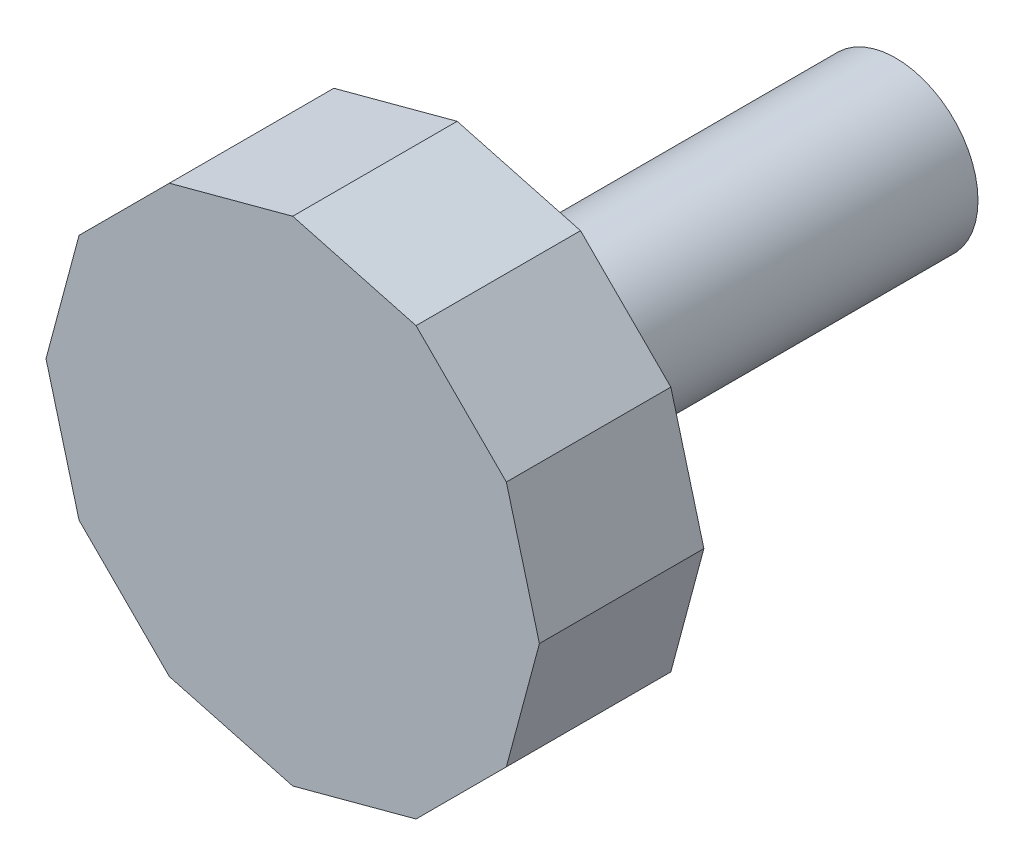
ISO-10303-21;
HEADER;
FILE_DESCRIPTION(('STEP AP214'),'2;1');
FILE_NAME('part.step','',(''),(''),'','','');
FILE_SCHEMA(('AUTOMOTIVE_DESIGN { 1 0 10303 214 1 1 1 1 }'));
ENDSEC;
DATA;
#1=APPLICATION_CONTEXT('core data for automotive mechanical design processes');
#2=APPLICATION_PROTOCOL_DEFINITION('international standard','automotive_design',2000,#1);
#3=PRODUCT_CONTEXT('',#1,'mechanical');
#4=PRODUCT('Part','Part','',(#3));
#5=PRODUCT_RELATED_PRODUCT_CATEGORY('part','',(#4));
#6=PRODUCT_DEFINITION_FORMATION('','',#4);
#7=PRODUCT_DEFINITION_CONTEXT('part definition',#1,'design');
#8=PRODUCT_DEFINITION('design','',#6,#7);
#9=PRODUCT_DEFINITION_SHAPE('','',#8);
#10=(LENGTH_UNIT() NAMED_UNIT(*) SI_UNIT(.MILLI.,.METRE.));
#11=(NAMED_UNIT(*) PLANE_ANGLE_UNIT() SI_UNIT($,.RADIAN.));
#12=(NAMED_UNIT(*) SI_UNIT($,.STERADIAN.) SOLID_ANGLE_UNIT());
#13=UNCERTAINTY_MEASURE_WITH_UNIT(LENGTH_MEASURE(1.E-05),#10,'distance_accuracy_value','');
#14=(GEOMETRIC_REPRESENTATION_CONTEXT(3) GLOBAL_UNCERTAINTY_ASSIGNED_CONTEXT((#13)) GLOBAL_UNIT_ASSIGNED_CONTEXT((#10,
#11,#12)) REPRESENTATION_CONTEXT('',''));
#15=CARTESIAN_POINT('',(0.,0.,0.));
#16=DIRECTION('',(0.,0.,1.));
#17=DIRECTION('',(1.,0.,0.));
#18=AXIS2_PLACEMENT_3D('',#15,#16,#17);
#19=CARTESIAN_POINT('',(0.,0.,8.));
#20=DIRECTION('',(0.,0.,-1.));
#21=DIRECTION('',(-1.,0.,0.));
#22=AXIS2_PLACEMENT_3D('',#19,#20,#21);
#23=CYLINDRICAL_SURFACE('',#22,1.5);
#24=CARTESIAN_POINT('',(0.,0.,8.));
#25=DIRECTION('',(0.,0.,1.));
#26=DIRECTION('',(1.,0.,0.));
#27=AXIS2_PLACEMENT_3D('',#24,#25,#26);
#28=CIRCLE('',#27,1.5);
#29=CARTESIAN_POINT('',(1.5,0.,8.));
#30=VERTEX_POINT('',#29);
#31=EDGE_CURVE('E11',#30,#30,#28,.T.);
#32=ORIENTED_EDGE('',*,*,#31,.F.);
#33=EDGE_LOOP('',(#32));
#34=FACE_BOUND('',#33,.T.);
#35=CARTESIAN_POINT('',(0.,0.,0.));
#36=DIRECTION('',(0.,0.,1.));
#37=DIRECTION('',(1.,0.,0.));
#38=AXIS2_PLACEMENT_3D('',#35,#36,#37);
#39=CIRCLE('',#38,1.5);
#40=CARTESIAN_POINT('',(1.5,0.,0.));
#41=VERTEX_POINT('',#40);
#42=EDGE_CURVE('E44',#41,#41,#39,.T.);
#43=ORIENTED_EDGE('',*,*,#42,.T.);
#44=EDGE_LOOP('',(#43));
#45=FACE_BOUND('',#44,.T.);
#46=ADVANCED_FACE('F41',(#34,#45),#23,.T.);
#47=CARTESIAN_POINT('',(0.,0.,0.));
#48=DIRECTION('',(0.,0.,1.));
#49=DIRECTION('',(1.,0.,0.));
#50=AXIS2_PLACEMENT_3D('',#47,#48,#49);
#51=PLANE('',#50);
#52=ORIENTED_EDGE('',*,*,#42,.F.);
#53=EDGE_LOOP('',(#52));
#54=FACE_BOUND('',#53,.T.);
#55=ADVANCED_FACE('F215',(#54),#51,.F.);
#56=CARTESIAN_POINT('',(3.89711431702997,-2.25,11.));
#57=DIRECTION('',(-0.965925826289068,0.258819045102521,0.));
#58=DIRECTION('',(-0.258819045102521,-0.965925826289068,0.));
#59=AXIS2_PLACEMENT_3D('',#56,#57,#58);
#60=PLANE('',#59);
#61=DIRECTION('',(0.258819045102521,0.965925826289068,0.));
#62=VECTOR('',#61,1.);
#63=CARTESIAN_POINT('',(3.89711431702997,-2.25,8.));
#64=LINE('',#63,#62);
#65=CARTESIAN_POINT('',(3.89711431702997,-2.25,8.));
#66=VERTEX_POINT('',#65);
#67=CARTESIAN_POINT('',(4.5,0.,8.));
#68=VERTEX_POINT('',#67);
#69=EDGE_CURVE('E162',#66,#68,#64,.T.);
#70=ORIENTED_EDGE('',*,*,#69,.T.);
#71=DIRECTION('',(0.,0.,-1.));
#72=VECTOR('',#71,1.);
#73=CARTESIAN_POINT('',(4.5,0.,11.));
#74=LINE('',#73,#72);
#75=CARTESIAN_POINT('',(4.5,0.,11.));
#76=VERTEX_POINT('',#75);
#77=EDGE_CURVE('E209',#76,#68,#74,.T.);
#78=ORIENTED_EDGE('',*,*,#77,.F.);
#79=DIRECTION('',(0.258819045102521,0.965925826289068,0.));
#80=VECTOR('',#79,1.);
#81=CARTESIAN_POINT('',(3.89711431702997,-2.25,11.));
#82=LINE('',#81,#80);
#83=CARTESIAN_POINT('',(3.89711431702997,-2.25,11.));
#84=VERTEX_POINT('',#83);
#85=EDGE_CURVE('E184',#84,#76,#82,.T.);
#86=ORIENTED_EDGE('',*,*,#85,.F.);
#87=DIRECTION('',(0.,0.,-1.));
#88=VECTOR('',#87,1.);
#89=CARTESIAN_POINT('',(3.89711431702997,-2.25,11.));
#90=LINE('',#89,#88);
#91=EDGE_CURVE('E158',#84,#66,#90,.T.);
#92=ORIENTED_EDGE('',*,*,#91,.T.);
#93=EDGE_LOOP('',(#70,#78,#86,#92));
#94=FACE_BOUND('',#93,.T.);
#95=ADVANCED_FACE('F217',(#94),#60,.F.);
#96=CARTESIAN_POINT('',(4.5,0.,11.));
#97=DIRECTION('',(-0.965925826289068,-0.258819045102521,0.));
#98=DIRECTION('',(0.258819045102521,-0.965925826289068,0.));
#99=AXIS2_PLACEMENT_3D('',#96,#97,#98);
#100=PLANE('',#99);
#101=DIRECTION('',(-0.258819045102521,0.965925826289068,0.));
#102=VECTOR('',#101,1.);
#103=CARTESIAN_POINT('',(4.5,0.,8.));
#104=LINE('',#103,#102);
#105=CARTESIAN_POINT('',(3.89711431702997,2.25,8.));
#106=VERTEX_POINT('',#105);
#107=EDGE_CURVE('E165',#68,#106,#104,.T.);
#108=ORIENTED_EDGE('',*,*,#107,.T.);
#109=DIRECTION('',(0.,0.,-1.));
#110=VECTOR('',#109,1.);
#111=CARTESIAN_POINT('',(3.89711431702997,2.25,11.));
#112=LINE('',#111,#110);
#113=CARTESIAN_POINT('',(3.89711431702997,2.25,11.));
#114=VERTEX_POINT('',#113);
#115=EDGE_CURVE('E206',#114,#106,#112,.T.);
#116=ORIENTED_EDGE('',*,*,#115,.F.);
#117=DIRECTION('',(-0.258819045102521,0.965925826289068,0.));
#118=VECTOR('',#117,1.);
#119=CARTESIAN_POINT('',(4.5,0.,11.));
#120=LINE('',#119,#118);
#121=EDGE_CURVE('E113',#76,#114,#120,.T.);
#122=ORIENTED_EDGE('',*,*,#121,.F.);
#123=ORIENTED_EDGE('',*,*,#77,.T.);
#124=EDGE_LOOP('',(#108,#116,#122,#123));
#125=FACE_BOUND('',#124,.T.);
#126=ADVANCED_FACE('F222',(#125),#100,.F.);
#127=CARTESIAN_POINT('',(3.89711431702997,2.25,11.));
#128=DIRECTION('',(-0.707106781186548,-0.707106781186547,0.));
#129=DIRECTION('',(0.707106781186547,-0.707106781186548,0.));
#130=AXIS2_PLACEMENT_3D('',#127,#128,#129);
#131=PLANE('',#130);
#132=DIRECTION('',(-0.707106781186547,0.707106781186548,0.));
#133=VECTOR('',#132,1.);
#134=CARTESIAN_POINT('',(3.89711431702997,2.25,8.));
#135=LINE('',#134,#133);
#136=CARTESIAN_POINT('',(2.25,3.89711431702997,8.));
#137=VERTEX_POINT('',#136);
#138=EDGE_CURVE('E167',#106,#137,#135,.T.);
#139=ORIENTED_EDGE('',*,*,#138,.T.);
#140=DIRECTION('',(0.,0.,-1.));
#141=VECTOR('',#140,1.);
#142=CARTESIAN_POINT('',(2.25,3.89711431702997,11.));
#143=LINE('',#142,#141);
#144=CARTESIAN_POINT('',(2.25,3.89711431702997,11.));
#145=VERTEX_POINT('',#144);
#146=EDGE_CURVE('E203',#145,#137,#143,.T.);
#147=ORIENTED_EDGE('',*,*,#146,.F.);
#148=DIRECTION('',(-0.707106781186547,0.707106781186548,0.));
#149=VECTOR('',#148,1.);
#150=CARTESIAN_POINT('',(3.89711431702997,2.25,11.));
#151=LINE('',#150,#149);
#152=EDGE_CURVE('E401',#114,#145,#151,.T.);
#153=ORIENTED_EDGE('',*,*,#152,.F.);
#154=ORIENTED_EDGE('',*,*,#115,.T.);
#155=EDGE_LOOP('',(#139,#147,#153,#154));
#156=FACE_BOUND('',#155,.T.);
#157=ADVANCED_FACE('F229',(#156),#131,.F.);
#158=CARTESIAN_POINT('',(2.25,3.89711431702997,11.));
#159=DIRECTION('',(-0.258819045102521,-0.965925826289068,0.));
#160=DIRECTION('',(0.965925826289068,-0.258819045102521,0.));
#161=AXIS2_PLACEMENT_3D('',#158,#159,#160);
#162=PLANE('',#161);
#163=DIRECTION('',(-0.965925826289068,0.258819045102521,0.));
#164=VECTOR('',#163,1.);
#165=CARTESIAN_POINT('',(2.25,3.89711431702997,8.));
#166=LINE('',#165,#164);
#167=CARTESIAN_POINT('',(0.,4.5,8.));
#168=VERTEX_POINT('',#167);
#169=EDGE_CURVE('E169',#137,#168,#166,.T.);
#170=ORIENTED_EDGE('',*,*,#169,.T.);
#171=DIRECTION('',(0.,0.,-1.));
#172=VECTOR('',#171,1.);
#173=CARTESIAN_POINT('',(0.,4.5,11.));
#174=LINE('',#173,#172);
#175=CARTESIAN_POINT('',(0.,4.5,11.));
#176=VERTEX_POINT('',#175);
#177=EDGE_CURVE('E200',#176,#168,#174,.T.);
#178=ORIENTED_EDGE('',*,*,#177,.F.);
#179=DIRECTION('',(-0.965925826289068,0.258819045102521,0.));
#180=VECTOR('',#179,1.);
#181=CARTESIAN_POINT('',(2.25,3.89711431702997,11.));
#182=LINE('',#181,#180);
#183=EDGE_CURVE('E405',#145,#176,#182,.T.);
#184=ORIENTED_EDGE('',*,*,#183,.F.);
#185=ORIENTED_EDGE('',*,*,#146,.T.);
#186=EDGE_LOOP('',(#170,#178,#184,#185));
#187=FACE_BOUND('',#186,.T.);
#188=ADVANCED_FACE('F232',(#187),#162,.F.);
#189=CARTESIAN_POINT('',(0.,4.5,11.));
#190=DIRECTION('',(0.258819045102521,-0.965925826289068,0.));
#191=DIRECTION('',(0.965925826289068,0.258819045102521,0.));
#192=AXIS2_PLACEMENT_3D('',#189,#190,#191);
#193=PLANE('',#192);
#194=DIRECTION('',(-0.965925826289068,-0.258819045102521,0.));
#195=VECTOR('',#194,1.);
#196=CARTESIAN_POINT('',(0.,4.5,8.));
#197=LINE('',#196,#195);
#198=CARTESIAN_POINT('',(-2.25,3.89711431702997,8.));
#199=VERTEX_POINT('',#198);
#200=EDGE_CURVE('E171',#168,#199,#197,.T.);
#201=ORIENTED_EDGE('',*,*,#200,.T.);
#202=DIRECTION('',(0.,0.,-1.));
#203=VECTOR('',#202,1.);
#204=CARTESIAN_POINT('',(-2.25,3.89711431702997,11.));
#205=LINE('',#204,#203);
#206=CARTESIAN_POINT('',(-2.25,3.89711431702997,11.));
#207=VERTEX_POINT('',#206);
#208=EDGE_CURVE('E197',#207,#199,#205,.T.);
#209=ORIENTED_EDGE('',*,*,#208,.F.);
#210=DIRECTION('',(-0.965925826289068,-0.258819045102521,0.));
#211=VECTOR('',#210,1.);
#212=CARTESIAN_POINT('',(0.,4.5,11.));
#213=LINE('',#212,#211);
#214=EDGE_CURVE('E407',#176,#207,#213,.T.);
#215=ORIENTED_EDGE('',*,*,#214,.F.);
#216=ORIENTED_EDGE('',*,*,#177,.T.);
#217=EDGE_LOOP('',(#201,#209,#215,#216));
#218=FACE_BOUND('',#217,.T.);
#219=ADVANCED_FACE('F236',(#218),#193,.F.);
#220=CARTESIAN_POINT('',(-2.25,3.89711431702997,11.));
#221=DIRECTION('',(0.707106781186547,-0.707106781186548,0.));
#222=DIRECTION('',(0.707106781186548,0.707106781186547,0.));
#223=AXIS2_PLACEMENT_3D('',#220,#221,#222);
#224=PLANE('',#223);
#225=DIRECTION('',(-0.707106781186548,-0.707106781186547,0.));
#226=VECTOR('',#225,1.);
#227=CARTESIAN_POINT('',(-2.25,3.89711431702997,8.));
#228=LINE('',#227,#226);
#229=CARTESIAN_POINT('',(-3.89711431702997,2.25,8.));
#230=VERTEX_POINT('',#229);
#231=EDGE_CURVE('E173',#199,#230,#228,.T.);
#232=ORIENTED_EDGE('',*,*,#231,.T.);
#233=DIRECTION('',(0.,0.,-1.));
#234=VECTOR('',#233,1.);
#235=CARTESIAN_POINT('',(-3.89711431702997,2.25,11.));
#236=LINE('',#235,#234);
#237=CARTESIAN_POINT('',(-3.89711431702997,2.25,11.));
#238=VERTEX_POINT('',#237);
#239=EDGE_CURVE('E194',#238,#230,#236,.T.);
#240=ORIENTED_EDGE('',*,*,#239,.F.);
#241=DIRECTION('',(-0.707106781186548,-0.707106781186547,0.));
#242=VECTOR('',#241,1.);
#243=CARTESIAN_POINT('',(-2.25,3.89711431702997,11.));
#244=LINE('',#243,#242);
#245=EDGE_CURVE('E409',#207,#238,#244,.T.);
#246=ORIENTED_EDGE('',*,*,#245,.F.);
#247=ORIENTED_EDGE('',*,*,#208,.T.);
#248=EDGE_LOOP('',(#232,#240,#246,#247));
#249=FACE_BOUND('',#248,.T.);
#250=ADVANCED_FACE('F240',(#249),#224,.F.);
#251=CARTESIAN_POINT('',(-3.89711431702997,2.25,11.));
#252=DIRECTION('',(0.965925826289068,-0.258819045102521,0.));
#253=DIRECTION('',(0.258819045102521,0.965925826289068,0.));
#254=AXIS2_PLACEMENT_3D('',#251,#252,#253);
#255=PLANE('',#254);
#256=DIRECTION('',(-0.258819045102521,-0.965925826289069,0.));
#257=VECTOR('',#256,1.);
#258=CARTESIAN_POINT('',(-3.89711431702997,2.25,8.));
#259=LINE('',#258,#257);
#260=CARTESIAN_POINT('',(-4.5,0.,8.));
#261=VERTEX_POINT('',#260);
#262=EDGE_CURVE('E175',#230,#261,#259,.T.);
#263=ORIENTED_EDGE('',*,*,#262,.T.);
#264=DIRECTION('',(0.,0.,-1.));
#265=VECTOR('',#264,1.);
#266=CARTESIAN_POINT('',(-4.5,0.,11.));
#267=LINE('',#266,#265);
#268=CARTESIAN_POINT('',(-4.5,0.,11.));
#269=VERTEX_POINT('',#268);
#270=EDGE_CURVE('E191',#269,#261,#267,.T.);
#271=ORIENTED_EDGE('',*,*,#270,.F.);
#272=DIRECTION('',(-0.258819045102521,-0.965925826289069,0.));
#273=VECTOR('',#272,1.);
#274=CARTESIAN_POINT('',(-3.89711431702997,2.25,11.));
#275=LINE('',#274,#273);
#276=EDGE_CURVE('E411',#238,#269,#275,.T.);
#277=ORIENTED_EDGE('',*,*,#276,.F.);
#278=ORIENTED_EDGE('',*,*,#239,.T.);
#279=EDGE_LOOP('',(#263,#271,#277,#278));
#280=FACE_BOUND('',#279,.T.);
#281=ADVANCED_FACE('F244',(#280),#255,.F.);
#282=CARTESIAN_POINT('',(-4.5,0.,11.));
#283=DIRECTION('',(0.965925826289068,0.25881904510252,0.));
#284=DIRECTION('',(-0.25881904510252,0.965925826289069,0.));
#285=AXIS2_PLACEMENT_3D('',#282,#283,#284);
#286=PLANE('',#285);
#287=DIRECTION('',(0.25881904510252,-0.965925826289069,0.));
#288=VECTOR('',#287,1.);
#289=CARTESIAN_POINT('',(-4.5,0.,8.));
#290=LINE('',#289,#288);
#291=CARTESIAN_POINT('',(-3.89711431702997,-2.25,8.));
#292=VERTEX_POINT('',#291);
#293=EDGE_CURVE('E177',#261,#292,#290,.T.);
#294=ORIENTED_EDGE('',*,*,#293,.T.);
#295=DIRECTION('',(0.,0.,-1.));
#296=VECTOR('',#295,1.);
#297=CARTESIAN_POINT('',(-3.89711431702997,-2.25,11.));
#298=LINE('',#297,#296);
#299=CARTESIAN_POINT('',(-3.89711431702997,-2.25,11.));
#300=VERTEX_POINT('',#299);
#301=EDGE_CURVE('E188',#300,#292,#298,.T.);
#302=ORIENTED_EDGE('',*,*,#301,.F.);
#303=DIRECTION('',(0.25881904510252,-0.965925826289069,0.));
#304=VECTOR('',#303,1.);
#305=CARTESIAN_POINT('',(-4.5,0.,11.));
#306=LINE('',#305,#304);
#307=EDGE_CURVE('E413',#269,#300,#306,.T.);
#308=ORIENTED_EDGE('',*,*,#307,.F.);
#309=ORIENTED_EDGE('',*,*,#270,.T.);
#310=EDGE_LOOP('',(#294,#302,#308,#309));
#311=FACE_BOUND('',#310,.T.);
#312=ADVANCED_FACE('F248',(#311),#286,.F.);
#313=CARTESIAN_POINT('',(-3.89711431702997,-2.25,11.));
#314=DIRECTION('',(0.707106781186548,0.707106781186547,0.));
#315=DIRECTION('',(-0.707106781186547,0.707106781186548,0.));
#316=AXIS2_PLACEMENT_3D('',#313,#314,#315);
#317=PLANE('',#316);
#318=DIRECTION('',(0.707106781186547,-0.707106781186548,0.));
#319=VECTOR('',#318,1.);
#320=CARTESIAN_POINT('',(-3.89711431702997,-2.25,8.));
#321=LINE('',#320,#319);
#322=CARTESIAN_POINT('',(-2.25,-3.89711431702997,8.));
#323=VERTEX_POINT('',#322);
#324=EDGE_CURVE('E179',#292,#323,#321,.T.);
#325=ORIENTED_EDGE('',*,*,#324,.T.);
#326=DIRECTION('',(0.,0.,-1.));
#327=VECTOR('',#326,1.);
#328=CARTESIAN_POINT('',(-2.25,-3.89711431702997,11.));
#329=LINE('',#328,#327);
#330=CARTESIAN_POINT('',(-2.25,-3.89711431702997,11.));
#331=VERTEX_POINT('',#330);
#332=EDGE_CURVE('E153',#331,#323,#329,.T.);
#333=ORIENTED_EDGE('',*,*,#332,.F.);
#334=DIRECTION('',(0.707106781186547,-0.707106781186548,0.));
#335=VECTOR('',#334,1.);
#336=CARTESIAN_POINT('',(-3.89711431702997,-2.25,11.));
#337=LINE('',#336,#335);
#338=EDGE_CURVE('E144',#300,#331,#337,.T.);
#339=ORIENTED_EDGE('',*,*,#338,.F.);
#340=ORIENTED_EDGE('',*,*,#301,.T.);
#341=EDGE_LOOP('',(#325,#333,#339,#340));
#342=FACE_BOUND('',#341,.T.);
#343=ADVANCED_FACE('F252',(#342),#317,.F.);
#344=CARTESIAN_POINT('',(-2.25,-3.89711431702997,11.));
#345=DIRECTION('',(0.258819045102521,0.965925826289068,0.));
#346=DIRECTION('',(-0.965925826289068,0.258819045102521,0.));
#347=AXIS2_PLACEMENT_3D('',#344,#345,#346);
#348=PLANE('',#347);
#349=DIRECTION('',(0.965925826289068,-0.258819045102521,0.));
#350=VECTOR('',#349,1.);
#351=CARTESIAN_POINT('',(-2.25,-3.89711431702997,8.));
#352=LINE('',#351,#350);
#353=CARTESIAN_POINT('',(0.,-4.5,8.));
#354=VERTEX_POINT('',#353);
#355=EDGE_CURVE('E152',#323,#354,#352,.T.);
#356=ORIENTED_EDGE('',*,*,#355,.T.);
#357=DIRECTION('',(0.,0.,-1.));
#358=VECTOR('',#357,1.);
#359=CARTESIAN_POINT('',(0.,-4.5,11.));
#360=LINE('',#359,#358);
#361=CARTESIAN_POINT('',(0.,-4.5,11.));
#362=VERTEX_POINT('',#361);
#363=EDGE_CURVE('E149',#362,#354,#360,.T.);
#364=ORIENTED_EDGE('',*,*,#363,.F.);
#365=DIRECTION('',(0.965925826289068,-0.258819045102521,0.));
#366=VECTOR('',#365,1.);
#367=CARTESIAN_POINT('',(-2.25,-3.89711431702997,11.));
#368=LINE('',#367,#366);
#369=EDGE_CURVE('E138',#331,#362,#368,.T.);
#370=ORIENTED_EDGE('',*,*,#369,.F.);
#371=ORIENTED_EDGE('',*,*,#332,.T.);
#372=EDGE_LOOP('',(#356,#364,#370,#371));
#373=FACE_BOUND('',#372,.T.);
#374=ADVANCED_FACE('F150',(#373),#348,.F.);
#375=CARTESIAN_POINT('',(0.,-4.5,11.));
#376=DIRECTION('',(-0.258819045102521,0.965925826289068,0.));
#377=DIRECTION('',(-0.965925826289068,-0.258819045102521,0.));
#378=AXIS2_PLACEMENT_3D('',#375,#376,#377);
#379=PLANE('',#378);
#380=DIRECTION('',(0.965925826289068,0.258819045102521,0.));
#381=VECTOR('',#380,1.);
#382=CARTESIAN_POINT('',(0.,-4.5,8.));
#383=LINE('',#382,#381);
#384=CARTESIAN_POINT('',(2.25,-3.89711431702997,8.));
#385=VERTEX_POINT('',#384);
#386=EDGE_CURVE('E98',#354,#385,#383,.T.);
#387=ORIENTED_EDGE('',*,*,#386,.T.);
#388=DIRECTION('',(0.,0.,-1.));
#389=VECTOR('',#388,1.);
#390=CARTESIAN_POINT('',(2.25,-3.89711431702997,11.));
#391=LINE('',#390,#389);
#392=CARTESIAN_POINT('',(2.25,-3.89711431702997,11.));
#393=VERTEX_POINT('',#392);
#394=EDGE_CURVE('E154',#393,#385,#391,.T.);
#395=ORIENTED_EDGE('',*,*,#394,.F.);
#396=DIRECTION('',(0.965925826289068,0.258819045102521,0.));
#397=VECTOR('',#396,1.);
#398=CARTESIAN_POINT('',(0.,-4.5,11.));
#399=LINE('',#398,#397);
#400=EDGE_CURVE('E142',#362,#393,#399,.T.);
#401=ORIENTED_EDGE('',*,*,#400,.F.);
#402=ORIENTED_EDGE('',*,*,#363,.T.);
#403=EDGE_LOOP('',(#387,#395,#401,#402));
#404=FACE_BOUND('',#403,.T.);
#405=ADVANCED_FACE('F156',(#404),#379,.F.);
#406=CARTESIAN_POINT('',(2.25,-3.89711431702997,11.));
#407=DIRECTION('',(-0.707106781186547,0.707106781186548,0.));
#408=DIRECTION('',(-0.707106781186548,-0.707106781186547,0.));
#409=AXIS2_PLACEMENT_3D('',#406,#407,#408);
#410=PLANE('',#409);
#411=DIRECTION('',(0.707106781186548,0.707106781186547,0.));
#412=VECTOR('',#411,1.);
#413=CARTESIAN_POINT('',(2.25,-3.89711431702997,8.));
#414=LINE('',#413,#412);
#415=EDGE_CURVE('E104',#385,#66,#414,.T.);
#416=ORIENTED_EDGE('',*,*,#415,.T.);
#417=ORIENTED_EDGE('',*,*,#91,.F.);
#418=DIRECTION('',(0.707106781186548,0.707106781186547,0.));
#419=VECTOR('',#418,1.);
#420=CARTESIAN_POINT('',(2.25,-3.89711431702997,11.));
#421=LINE('',#420,#419);
#422=EDGE_CURVE('E57',#393,#84,#421,.T.);
#423=ORIENTED_EDGE('',*,*,#422,.F.);
#424=ORIENTED_EDGE('',*,*,#394,.T.);
#425=EDGE_LOOP('',(#416,#417,#423,#424));
#426=FACE_BOUND('',#425,.T.);
#427=ADVANCED_FACE('F261',(#426),#410,.F.);
#428=CARTESIAN_POINT('',(0.,0.,11.));
#429=DIRECTION('',(0.,0.,1.));
#430=DIRECTION('',(1.,0.,0.));
#431=AXIS2_PLACEMENT_3D('',#428,#429,#430);
#432=PLANE('',#431);
#433=ORIENTED_EDGE('',*,*,#85,.T.);
#434=ORIENTED_EDGE('',*,*,#121,.T.);
#435=ORIENTED_EDGE('',*,*,#152,.T.);
#436=ORIENTED_EDGE('',*,*,#183,.T.);
#437=ORIENTED_EDGE('',*,*,#214,.T.);
#438=ORIENTED_EDGE('',*,*,#245,.T.);
#439=ORIENTED_EDGE('',*,*,#276,.T.);
#440=ORIENTED_EDGE('',*,*,#307,.T.);
#441=ORIENTED_EDGE('',*,*,#338,.T.);
#442=ORIENTED_EDGE('',*,*,#369,.T.);
#443=ORIENTED_EDGE('',*,*,#400,.T.);
#444=ORIENTED_EDGE('',*,*,#422,.T.);
#445=EDGE_LOOP('',(#433,#434,#435,#436,#437,#438,#439,#440,#441,#442,#443,#444));
#446=FACE_BOUND('',#445,.T.);
#447=ADVANCED_FACE('F140',(#446),#432,.T.);
#448=CARTESIAN_POINT('',(0.,0.,8.));
#449=DIRECTION('',(0.,0.,1.));
#450=DIRECTION('',(1.,0.,0.));
#451=AXIS2_PLACEMENT_3D('',#448,#449,#450);
#452=PLANE('',#451);
#453=ORIENTED_EDGE('',*,*,#31,.T.);
#454=EDGE_LOOP('',(#453));
#455=FACE_BOUND('',#454,.T.);
#456=ORIENTED_EDGE('',*,*,#69,.F.);
#457=ORIENTED_EDGE('',*,*,#415,.F.);
#458=ORIENTED_EDGE('',*,*,#386,.F.);
#459=ORIENTED_EDGE('',*,*,#355,.F.);
#460=ORIENTED_EDGE('',*,*,#324,.F.);
#461=ORIENTED_EDGE('',*,*,#293,.F.);
#462=ORIENTED_EDGE('',*,*,#262,.F.);
#463=ORIENTED_EDGE('',*,*,#231,.F.);
#464=ORIENTED_EDGE('',*,*,#200,.F.);
#465=ORIENTED_EDGE('',*,*,#169,.F.);
#466=ORIENTED_EDGE('',*,*,#138,.F.);
#467=ORIENTED_EDGE('',*,*,#107,.F.);
#468=EDGE_LOOP('',(#456,#457,#458,#459,#460,#461,#462,#463,#464,#465,#466,#467));
#469=FACE_BOUND('',#468,.T.);
#470=ADVANCED_FACE('F264',(#455,#469),#452,.F.);
#471=CLOSED_SHELL('',(#46,#55,#95,#126,#157,#188,#219,#250,#281,#312,#343,#374,#405,#427,#447,#470));
#472=MANIFOLD_SOLID_BREP('B2',#471);
#473=ADVANCED_BREP_SHAPE_REPRESENTATION('',(#18,#472),#14);
#474=SHAPE_DEFINITION_REPRESENTATION(#9,#473);
ENDSEC;
END-ISO-10303-21;
